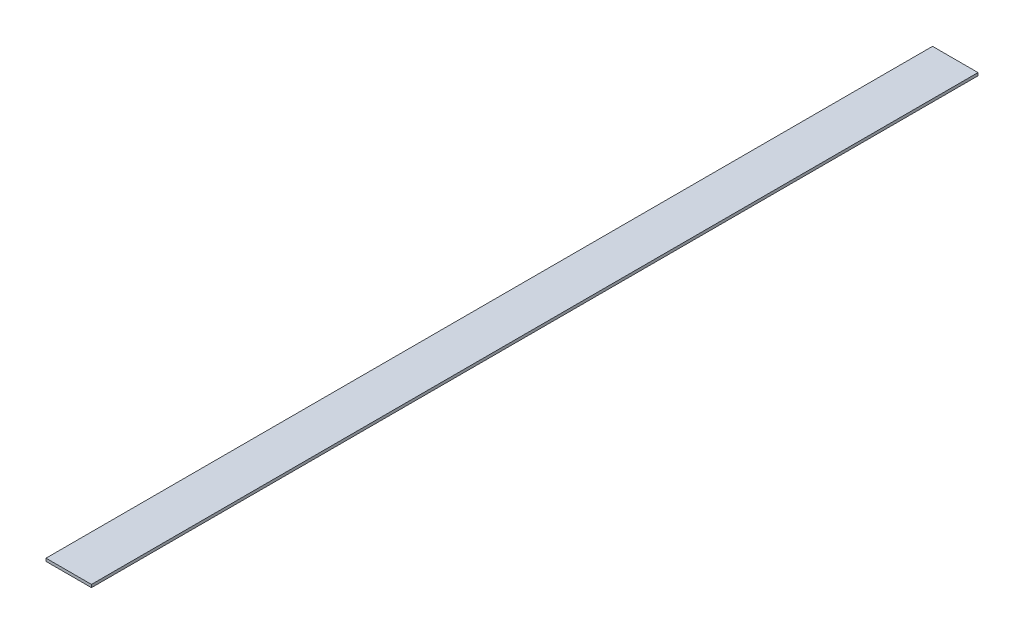
ISO-10303-21;
HEADER;
FILE_DESCRIPTION(('STEP AP214'),'2;1');
FILE_NAME('part.step','',(''),(''),'','','');
FILE_SCHEMA(('AUTOMOTIVE_DESIGN { 1 0 10303 214 1 1 1 1 }'));
ENDSEC;
DATA;
#1=APPLICATION_CONTEXT('core data for automotive mechanical design processes');
#2=APPLICATION_PROTOCOL_DEFINITION('international standard','automotive_design',2000,#1);
#3=PRODUCT_CONTEXT('',#1,'mechanical');
#4=PRODUCT('Part','Part','',(#3));
#5=PRODUCT_RELATED_PRODUCT_CATEGORY('part','',(#4));
#6=PRODUCT_DEFINITION_FORMATION('','',#4);
#7=PRODUCT_DEFINITION_CONTEXT('part definition',#1,'design');
#8=PRODUCT_DEFINITION('design','',#6,#7);
#9=PRODUCT_DEFINITION_SHAPE('','',#8);
#10=(LENGTH_UNIT() NAMED_UNIT(*) SI_UNIT(.MILLI.,.METRE.));
#11=(NAMED_UNIT(*) PLANE_ANGLE_UNIT() SI_UNIT($,.RADIAN.));
#12=(NAMED_UNIT(*) SI_UNIT($,.STERADIAN.) SOLID_ANGLE_UNIT());
#13=UNCERTAINTY_MEASURE_WITH_UNIT(LENGTH_MEASURE(1.E-05),#10,'distance_accuracy_value','');
#14=(GEOMETRIC_REPRESENTATION_CONTEXT(3) GLOBAL_UNCERTAINTY_ASSIGNED_CONTEXT((#13)) GLOBAL_UNIT_ASSIGNED_CONTEXT((#10,
#11,#12)) REPRESENTATION_CONTEXT('',''));
#15=CARTESIAN_POINT('',(0.,0.,0.));
#16=DIRECTION('',(0.,0.,1.));
#17=DIRECTION('',(1.,0.,0.));
#18=AXIS2_PLACEMENT_3D('',#15,#16,#17);
#19=CARTESIAN_POINT('',(25.4,3.175,495.3));
#20=DIRECTION('',(-1.,0.,0.));
#21=DIRECTION('',(0.,0.,1.));
#22=AXIS2_PLACEMENT_3D('',#19,#20,#21);
#23=PLANE('',#22);
#24=DIRECTION('',(0.,0.,-1.));
#25=VECTOR('',#24,1.);
#26=CARTESIAN_POINT('',(25.4,0.,495.3));
#27=LINE('',#26,#25);
#28=CARTESIAN_POINT('',(25.4,0.,495.3));
#29=VERTEX_POINT('',#28);
#30=CARTESIAN_POINT('',(25.4,0.,-495.3));
#31=VERTEX_POINT('',#30);
#32=EDGE_CURVE('E97',#29,#31,#27,.T.);
#33=ORIENTED_EDGE('',*,*,#32,.T.);
#34=DIRECTION('',(0.,-1.,0.));
#35=VECTOR('',#34,1.);
#36=CARTESIAN_POINT('',(25.4,3.175,-495.3));
#37=LINE('',#36,#35);
#38=CARTESIAN_POINT('',(25.4,3.175,-495.3));
#39=VERTEX_POINT('',#38);
#40=EDGE_CURVE('E11',#39,#31,#37,.T.);
#41=ORIENTED_EDGE('',*,*,#40,.F.);
#42=DIRECTION('',(0.,0.,-1.));
#43=VECTOR('',#42,1.);
#44=CARTESIAN_POINT('',(25.4,3.175,495.3));
#45=LINE('',#44,#43);
#46=CARTESIAN_POINT('',(25.4,3.175,495.3));
#47=VERTEX_POINT('',#46);
#48=EDGE_CURVE('E85',#47,#39,#45,.T.);
#49=ORIENTED_EDGE('',*,*,#48,.F.);
#50=DIRECTION('',(0.,-1.,0.));
#51=VECTOR('',#50,1.);
#52=CARTESIAN_POINT('',(25.4,3.175,495.3));
#53=LINE('',#52,#51);
#54=EDGE_CURVE('E93',#47,#29,#53,.T.);
#55=ORIENTED_EDGE('',*,*,#54,.T.);
#56=EDGE_LOOP('',(#33,#41,#49,#55));
#57=FACE_BOUND('',#56,.T.);
#58=ADVANCED_FACE('F34',(#57),#23,.F.);
#59=CARTESIAN_POINT('',(-25.4,3.175,-495.3));
#60=DIRECTION('',(0.,0.,1.));
#61=DIRECTION('',(1.,0.,0.));
#62=AXIS2_PLACEMENT_3D('',#59,#60,#61);
#63=PLANE('',#62);
#64=DIRECTION('',(-1.,0.,0.));
#65=VECTOR('',#64,1.);
#66=CARTESIAN_POINT('',(-25.4,0.,-495.3));
#67=LINE('',#66,#65);
#68=CARTESIAN_POINT('',(-25.4,0.,-495.3));
#69=VERTEX_POINT('',#68);
#70=EDGE_CURVE('E89',#31,#69,#67,.T.);
#71=ORIENTED_EDGE('',*,*,#70,.T.);
#72=DIRECTION('',(0.,-1.,0.));
#73=VECTOR('',#72,1.);
#74=CARTESIAN_POINT('',(-25.4,3.175,-495.3));
#75=LINE('',#74,#73);
#76=CARTESIAN_POINT('',(-25.4,3.175,-495.3));
#77=VERTEX_POINT('',#76);
#78=EDGE_CURVE('E42',#77,#69,#75,.T.);
#79=ORIENTED_EDGE('',*,*,#78,.F.);
#80=DIRECTION('',(-1.,0.,0.));
#81=VECTOR('',#80,1.);
#82=CARTESIAN_POINT('',(-25.4,3.175,-495.3));
#83=LINE('',#82,#81);
#84=EDGE_CURVE('E80',#39,#77,#83,.T.);
#85=ORIENTED_EDGE('',*,*,#84,.F.);
#86=ORIENTED_EDGE('',*,*,#40,.T.);
#87=EDGE_LOOP('',(#71,#79,#85,#86));
#88=FACE_BOUND('',#87,.T.);
#89=ADVANCED_FACE('F88',(#88),#63,.F.);
#90=CARTESIAN_POINT('',(-25.4,3.175,495.3));
#91=DIRECTION('',(1.,0.,0.));
#92=DIRECTION('',(0.,0.,-1.));
#93=AXIS2_PLACEMENT_3D('',#90,#91,#92);
#94=PLANE('',#93);
#95=DIRECTION('',(0.,0.,1.));
#96=VECTOR('',#95,1.);
#97=CARTESIAN_POINT('',(-25.4,0.,495.3));
#98=LINE('',#97,#96);
#99=CARTESIAN_POINT('',(-25.4,0.,495.3));
#100=VERTEX_POINT('',#99);
#101=EDGE_CURVE('E67',#69,#100,#98,.T.);
#102=ORIENTED_EDGE('',*,*,#101,.T.);
#103=DIRECTION('',(0.,-1.,0.));
#104=VECTOR('',#103,1.);
#105=CARTESIAN_POINT('',(-25.4,3.175,495.3));
#106=LINE('',#105,#104);
#107=CARTESIAN_POINT('',(-25.4,3.175,495.3));
#108=VERTEX_POINT('',#107);
#109=EDGE_CURVE('E90',#108,#100,#106,.T.);
#110=ORIENTED_EDGE('',*,*,#109,.F.);
#111=DIRECTION('',(0.,0.,1.));
#112=VECTOR('',#111,1.);
#113=CARTESIAN_POINT('',(-25.4,3.175,495.3));
#114=LINE('',#113,#112);
#115=EDGE_CURVE('E83',#77,#108,#114,.T.);
#116=ORIENTED_EDGE('',*,*,#115,.F.);
#117=ORIENTED_EDGE('',*,*,#78,.T.);
#118=EDGE_LOOP('',(#102,#110,#116,#117));
#119=FACE_BOUND('',#118,.T.);
#120=ADVANCED_FACE('F91',(#119),#94,.F.);
#121=CARTESIAN_POINT('',(-25.4,3.175,495.3));
#122=DIRECTION('',(0.,0.,-1.));
#123=DIRECTION('',(-1.,0.,0.));
#124=AXIS2_PLACEMENT_3D('',#121,#122,#123);
#125=PLANE('',#124);
#126=DIRECTION('',(1.,0.,0.));
#127=VECTOR('',#126,1.);
#128=CARTESIAN_POINT('',(-25.4,0.,495.3));
#129=LINE('',#128,#127);
#130=EDGE_CURVE('E73',#100,#29,#129,.T.);
#131=ORIENTED_EDGE('',*,*,#130,.T.);
#132=ORIENTED_EDGE('',*,*,#54,.F.);
#133=DIRECTION('',(1.,0.,0.));
#134=VECTOR('',#133,1.);
#135=CARTESIAN_POINT('',(-25.4,3.175,495.3));
#136=LINE('',#135,#134);
#137=EDGE_CURVE('E50',#108,#47,#136,.T.);
#138=ORIENTED_EDGE('',*,*,#137,.F.);
#139=ORIENTED_EDGE('',*,*,#109,.T.);
#140=EDGE_LOOP('',(#131,#132,#138,#139));
#141=FACE_BOUND('',#140,.T.);
#142=ADVANCED_FACE('F104',(#141),#125,.F.);
#143=CARTESIAN_POINT('',(0.,3.175,0.));
#144=DIRECTION('',(0.,-1.,0.));
#145=DIRECTION('',(0.,0.,-1.));
#146=AXIS2_PLACEMENT_3D('',#143,#144,#145);
#147=PLANE('',#146);
#148=ORIENTED_EDGE('',*,*,#48,.T.);
#149=ORIENTED_EDGE('',*,*,#84,.T.);
#150=ORIENTED_EDGE('',*,*,#115,.T.);
#151=ORIENTED_EDGE('',*,*,#137,.T.);
#152=EDGE_LOOP('',(#148,#149,#150,#151));
#153=FACE_BOUND('',#152,.T.);
#154=ADVANCED_FACE('F81',(#153),#147,.F.);
#155=CARTESIAN_POINT('',(0.,0.,0.));
#156=DIRECTION('',(0.,-1.,0.));
#157=DIRECTION('',(0.,0.,-1.));
#158=AXIS2_PLACEMENT_3D('',#155,#156,#157);
#159=PLANE('',#158);
#160=ORIENTED_EDGE('',*,*,#32,.F.);
#161=ORIENTED_EDGE('',*,*,#130,.F.);
#162=ORIENTED_EDGE('',*,*,#101,.F.);
#163=ORIENTED_EDGE('',*,*,#70,.F.);
#164=EDGE_LOOP('',(#160,#161,#162,#163));
#165=FACE_BOUND('',#164,.T.);
#166=ADVANCED_FACE('F107',(#165),#159,.T.);
#167=CLOSED_SHELL('',(#58,#89,#120,#142,#154,#166));
#168=MANIFOLD_SOLID_BREP('B2',#167);
#169=ADVANCED_BREP_SHAPE_REPRESENTATION('',(#18,#168),#14);
#170=SHAPE_DEFINITION_REPRESENTATION(#9,#169);
ENDSEC;
END-ISO-10303-21;
